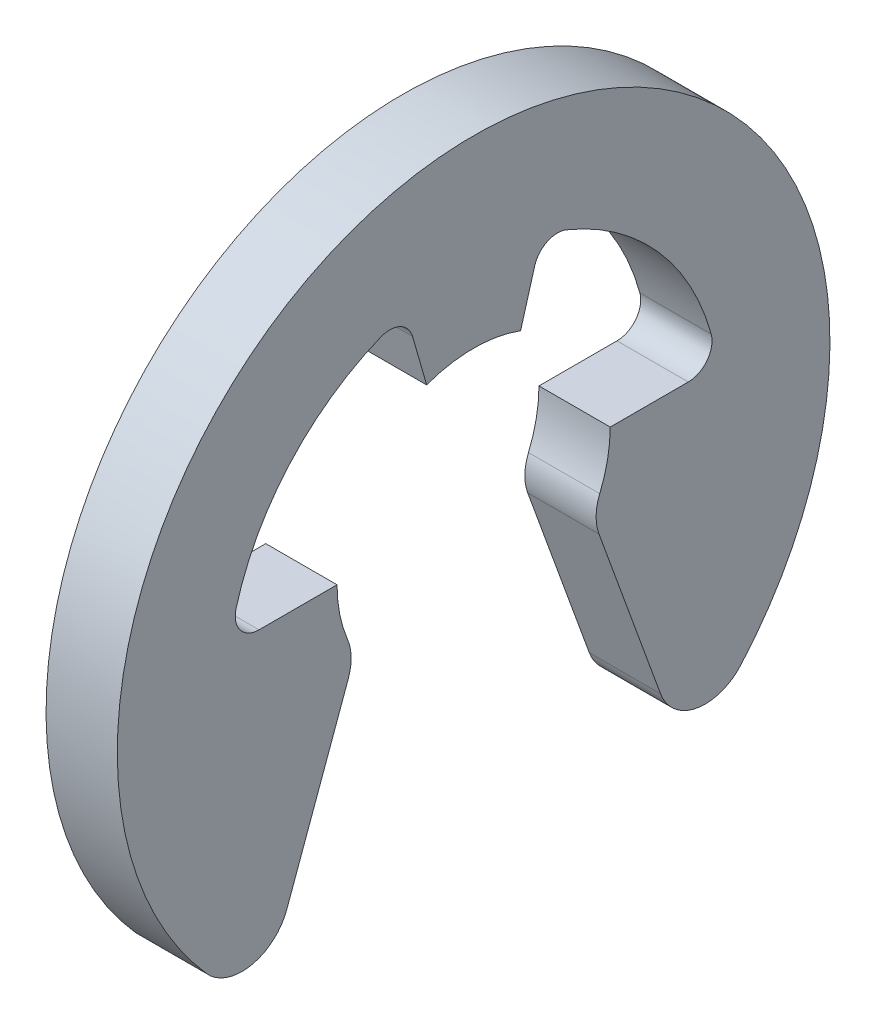
ISO-10303-21;
HEADER;
FILE_DESCRIPTION(('STEP AP214'),'2;1');
FILE_NAME('part.step','',(''),(''),'','','');
FILE_SCHEMA(('AUTOMOTIVE_DESIGN { 1 0 10303 214 1 1 1 1 }'));
ENDSEC;
DATA;
#1=APPLICATION_CONTEXT('core data for automotive mechanical design processes');
#2=APPLICATION_PROTOCOL_DEFINITION('international standard','automotive_design',2000,#1);
#3=PRODUCT_CONTEXT('',#1,'mechanical');
#4=PRODUCT('Part','Part','',(#3));
#5=PRODUCT_RELATED_PRODUCT_CATEGORY('part','',(#4));
#6=PRODUCT_DEFINITION_FORMATION('','',#4);
#7=PRODUCT_DEFINITION_CONTEXT('part definition',#1,'design');
#8=PRODUCT_DEFINITION('design','',#6,#7);
#9=PRODUCT_DEFINITION_SHAPE('','',#8);
#10=(LENGTH_UNIT() NAMED_UNIT(*) SI_UNIT(.MILLI.,.METRE.));
#11=(NAMED_UNIT(*) PLANE_ANGLE_UNIT() SI_UNIT($,.RADIAN.));
#12=(NAMED_UNIT(*) SI_UNIT($,.STERADIAN.) SOLID_ANGLE_UNIT());
#13=UNCERTAINTY_MEASURE_WITH_UNIT(LENGTH_MEASURE(1.E-05),#10,'distance_accuracy_value','');
#14=(GEOMETRIC_REPRESENTATION_CONTEXT(3) GLOBAL_UNCERTAINTY_ASSIGNED_CONTEXT((#13)) GLOBAL_UNIT_ASSIGNED_CONTEXT((#10,
#11,#12)) REPRESENTATION_CONTEXT('',''));
#15=CARTESIAN_POINT('',(0.,0.,0.));
#16=DIRECTION('',(0.,0.,1.));
#17=DIRECTION('',(1.,0.,0.));
#18=AXIS2_PLACEMENT_3D('',#15,#16,#17);
#19=CARTESIAN_POINT('',(0.6,0.5,-1.80710403685012));
#20=DIRECTION('',(-1.,0.,0.));
#21=DIRECTION('',(0.,0.,1.));
#22=AXIS2_PLACEMENT_3D('',#19,#20,#21);
#23=CYLINDRICAL_SURFACE('',#22,0.2);
#24=CARTESIAN_POINT('',(0.,0.5,-1.80710403685012));
#25=DIRECTION('',(-1.,0.,0.));
#26=DIRECTION('',(0.,0.,1.));
#27=AXIS2_PLACEMENT_3D('',#24,#25,#26);
#28=CIRCLE('',#27,0.2);
#29=CARTESIAN_POINT('',(0.,0.553333333333334,-1.9998618007808));
#30=VERTEX_POINT('',#29);
#31=CARTESIAN_POINT('',(0.,0.3,-1.80710403685012));
#32=VERTEX_POINT('',#31);
#33=EDGE_CURVE('E201',#30,#32,#28,.T.);
#34=ORIENTED_EDGE('',*,*,#33,.T.);
#35=DIRECTION('',(-1.,0.,0.));
#36=VECTOR('',#35,1.);
#37=CARTESIAN_POINT('',(0.6,0.3,-1.80710403685012));
#38=LINE('',#37,#36);
#39=CARTESIAN_POINT('',(0.6,0.3,-1.80710403685012));
#40=VERTEX_POINT('',#39);
#41=EDGE_CURVE('E11',#40,#32,#38,.T.);
#42=ORIENTED_EDGE('',*,*,#41,.F.);
#43=CARTESIAN_POINT('',(0.6,0.5,-1.80710403685012));
#44=DIRECTION('',(-1.,0.,0.));
#45=DIRECTION('',(0.,0.,1.));
#46=AXIS2_PLACEMENT_3D('',#43,#44,#45);
#47=CIRCLE('',#46,0.2);
#48=CARTESIAN_POINT('',(0.6,0.553333333333334,-1.9998618007808));
#49=VERTEX_POINT('',#48);
#50=EDGE_CURVE('E123',#49,#40,#47,.T.);
#51=ORIENTED_EDGE('',*,*,#50,.F.);
#52=DIRECTION('',(-1.,0.,0.));
#53=VECTOR('',#52,1.);
#54=CARTESIAN_POINT('',(0.6,0.553333333333334,-1.9998618007808));
#55=LINE('',#54,#53);
#56=EDGE_CURVE('E50',#49,#30,#55,.T.);
#57=ORIENTED_EDGE('',*,*,#56,.T.);
#58=EDGE_LOOP('',(#34,#42,#51,#57));
#59=FACE_BOUND('',#58,.T.);
#60=ADVANCED_FACE('F34',(#59),#23,.F.);
#61=CARTESIAN_POINT('',(0.6,0.3,-1.15));
#62=DIRECTION('',(0.,1.,0.));
#63=DIRECTION('',(0.,0.,1.));
#64=AXIS2_PLACEMENT_3D('',#61,#62,#63);
#65=PLANE('',#64);
#66=DIRECTION('',(0.,0.,-1.));
#67=VECTOR('',#66,1.);
#68=CARTESIAN_POINT('',(0.,0.3,-1.15));
#69=LINE('',#68,#67);
#70=CARTESIAN_POINT('',(0.,0.3,-1.15));
#71=VERTEX_POINT('',#70);
#72=EDGE_CURVE('E203',#71,#32,#69,.T.);
#73=ORIENTED_EDGE('',*,*,#72,.F.);
#74=DIRECTION('',(-1.,0.,0.));
#75=VECTOR('',#74,1.);
#76=CARTESIAN_POINT('',(0.6,0.3,-1.15));
#77=LINE('',#76,#75);
#78=CARTESIAN_POINT('',(0.6,0.3,-1.15));
#79=VERTEX_POINT('',#78);
#80=EDGE_CURVE('E42',#79,#71,#77,.T.);
#81=ORIENTED_EDGE('',*,*,#80,.F.);
#82=DIRECTION('',(0.,0.,-1.));
#83=VECTOR('',#82,1.);
#84=CARTESIAN_POINT('',(0.6,0.3,-1.15));
#85=LINE('',#84,#83);
#86=EDGE_CURVE('E301',#79,#40,#85,.T.);
#87=ORIENTED_EDGE('',*,*,#86,.T.);
#88=ORIENTED_EDGE('',*,*,#41,.T.);
#89=EDGE_LOOP('',(#73,#81,#87,#88));
#90=FACE_BOUND('',#89,.T.);
#91=ADVANCED_FACE('F300',(#90),#65,.T.);
#92=CARTESIAN_POINT('',(0.6,0.3,0.));
#93=DIRECTION('',(-1.,0.,0.));
#94=DIRECTION('',(0.,0.,1.));
#95=AXIS2_PLACEMENT_3D('',#92,#93,#94);
#96=CYLINDRICAL_SURFACE('',#95,1.15);
#97=CARTESIAN_POINT('',(0.,0.3,0.));
#98=DIRECTION('',(-1.,0.,0.));
#99=DIRECTION('',(0.,0.,1.));
#100=AXIS2_PLACEMENT_3D('',#97,#98,#99);
#101=CIRCLE('',#100,1.15);
#102=CARTESIAN_POINT('',(0.,-0.141786382645896,-1.06175552370056));
#103=VERTEX_POINT('',#102);
#104=EDGE_CURVE('E206',#71,#103,#101,.T.);
#105=ORIENTED_EDGE('',*,*,#104,.T.);
#106=DIRECTION('',(-1.,0.,0.));
#107=VECTOR('',#106,1.);
#108=CARTESIAN_POINT('',(0.6,-0.141786382645896,-1.06175552370056));
#109=LINE('',#108,#107);
#110=CARTESIAN_POINT('',(0.6,-0.141786382645896,-1.06175552370056));
#111=VERTEX_POINT('',#110);
#112=EDGE_CURVE('E286',#111,#103,#109,.T.);
#113=ORIENTED_EDGE('',*,*,#112,.F.);
#114=CARTESIAN_POINT('',(0.6,0.3,0.));
#115=DIRECTION('',(-1.,0.,0.));
#116=DIRECTION('',(0.,0.,1.));
#117=AXIS2_PLACEMENT_3D('',#114,#115,#116);
#118=CIRCLE('',#117,1.15);
#119=EDGE_CURVE('E292',#79,#111,#118,.T.);
#120=ORIENTED_EDGE('',*,*,#119,.F.);
#121=ORIENTED_EDGE('',*,*,#80,.T.);
#122=EDGE_LOOP('',(#105,#113,#120,#121));
#123=FACE_BOUND('',#122,.T.);
#124=ADVANCED_FACE('F290',(#123),#96,.F.);
#125=CARTESIAN_POINT('',(0.6,-0.295451211392294,-1.4310617928138));
#126=DIRECTION('',(-1.,0.,0.));
#127=DIRECTION('',(0.,0.,1.));
#128=AXIS2_PLACEMENT_3D('',#125,#126,#127);
#129=CYLINDRICAL_SURFACE('',#128,0.400000000000001);
#130=CARTESIAN_POINT('',(0.,-0.295451211392294,-1.4310617928138));
#131=DIRECTION('',(-1.,0.,0.));
#132=DIRECTION('',(0.,0.,1.));
#133=AXIS2_PLACEMENT_3D('',#130,#131,#132);
#134=CIRCLE('',#133,0.400000000000001);
#135=CARTESIAN_POINT('',(0.,-0.432259268722562,-1.05518474449944));
#136=VERTEX_POINT('',#135);
#137=EDGE_CURVE('E209',#136,#103,#134,.T.);
#138=ORIENTED_EDGE('',*,*,#137,.F.);
#139=DIRECTION('',(-1.,0.,0.));
#140=VECTOR('',#139,1.);
#141=CARTESIAN_POINT('',(0.6,-0.432259268722562,-1.05518474449944));
#142=LINE('',#141,#140);
#143=CARTESIAN_POINT('',(0.6,-0.432259268722562,-1.05518474449944));
#144=VERTEX_POINT('',#143);
#145=EDGE_CURVE('E284',#144,#136,#142,.T.);
#146=ORIENTED_EDGE('',*,*,#145,.F.);
#147=CARTESIAN_POINT('',(0.6,-0.295451211392294,-1.4310617928138));
#148=DIRECTION('',(-1.,0.,0.));
#149=DIRECTION('',(0.,0.,1.));
#150=AXIS2_PLACEMENT_3D('',#147,#148,#149);
#151=CIRCLE('',#150,0.400000000000001);
#152=EDGE_CURVE('E549',#144,#111,#151,.T.);
#153=ORIENTED_EDGE('',*,*,#152,.T.);
#154=ORIENTED_EDGE('',*,*,#112,.T.);
#155=EDGE_LOOP('',(#138,#146,#153,#154));
#156=FACE_BOUND('',#155,.T.);
#157=ADVANCED_FACE('F319',(#156),#129,.T.);
#158=CARTESIAN_POINT('',(0.6,-0.432259268722562,-1.05518474449944));
#159=DIRECTION('',(0.,0.34202014332567,-0.939692620785908));
#160=DIRECTION('',(0.,0.939692620785908,0.34202014332567));
#161=AXIS2_PLACEMENT_3D('',#158,#159,#160);
#162=PLANE('',#161);
#163=DIRECTION('',(0.,-0.939692620785908,-0.34202014332567));
#164=VECTOR('',#163,1.);
#165=CARTESIAN_POINT('',(0.,-0.432259268722562,-1.05518474449944));
#166=LINE('',#165,#164);
#167=CARTESIAN_POINT('',(0.,-1.85697983333298,-1.57374062216457));
#168=VERTEX_POINT('',#167);
#169=EDGE_CURVE('E212',#136,#168,#166,.T.);
#170=ORIENTED_EDGE('',*,*,#169,.T.);
#171=DIRECTION('',(-1.,0.,0.));
#172=VECTOR('',#171,1.);
#173=CARTESIAN_POINT('',(0.6,-1.85697983333298,-1.57374062216457));
#174=LINE('',#173,#172);
#175=CARTESIAN_POINT('',(0.6,-1.85697983333298,-1.57374062216457));
#176=VERTEX_POINT('',#175);
#177=EDGE_CURVE('E282',#176,#168,#174,.T.);
#178=ORIENTED_EDGE('',*,*,#177,.F.);
#179=DIRECTION('',(0.,-0.939692620785908,-0.34202014332567));
#180=VECTOR('',#179,1.);
#181=CARTESIAN_POINT('',(0.6,-0.432259268722562,-1.05518474449944));
#182=LINE('',#181,#180);
#183=EDGE_CURVE('E550',#144,#176,#182,.T.);
#184=ORIENTED_EDGE('',*,*,#183,.F.);
#185=ORIENTED_EDGE('',*,*,#145,.T.);
#186=EDGE_LOOP('',(#170,#178,#184,#185));
#187=FACE_BOUND('',#186,.T.);
#188=ADVANCED_FACE('F324',(#187),#162,.F.);
#189=CARTESIAN_POINT('',(0.6,-1.72017177600271,-1.94961767047893));
#190=DIRECTION('',(-1.,0.,0.));
#191=DIRECTION('',(0.,0.,1.));
#192=AXIS2_PLACEMENT_3D('',#189,#190,#191);
#193=CYLINDRICAL_SURFACE('',#192,0.399999999999999);
#194=CARTESIAN_POINT('',(0.,-1.72017177600271,-1.94961767047893));
#195=DIRECTION('',(-1.,0.,0.));
#196=DIRECTION('',(0.,0.,1.));
#197=AXIS2_PLACEMENT_3D('',#194,#195,#196);
#198=CIRCLE('',#197,0.399999999999999);
#199=CARTESIAN_POINT('',(0.,-1.98481358769543,-2.24955885055261));
#200=VERTEX_POINT('',#199);
#201=EDGE_CURVE('E215',#200,#168,#198,.T.);
#202=ORIENTED_EDGE('',*,*,#201,.F.);
#203=DIRECTION('',(-1.,0.,0.));
#204=VECTOR('',#203,1.);
#205=CARTESIAN_POINT('',(0.6,-1.98481358769543,-2.24955885055261));
#206=LINE('',#205,#204);
#207=CARTESIAN_POINT('',(0.6,-1.98481358769543,-2.24955885055261));
#208=VERTEX_POINT('',#207);
#209=EDGE_CURVE('E280',#208,#200,#206,.T.);
#210=ORIENTED_EDGE('',*,*,#209,.F.);
#211=CARTESIAN_POINT('',(0.6,-1.72017177600271,-1.94961767047893));
#212=DIRECTION('',(-1.,0.,0.));
#213=DIRECTION('',(0.,0.,1.));
#214=AXIS2_PLACEMENT_3D('',#211,#212,#213);
#215=CIRCLE('',#214,0.399999999999999);
#216=EDGE_CURVE('E545',#208,#176,#215,.T.);
#217=ORIENTED_EDGE('',*,*,#216,.T.);
#218=ORIENTED_EDGE('',*,*,#177,.T.);
#219=EDGE_LOOP('',(#202,#210,#217,#218));
#220=FACE_BOUND('',#219,.T.);
#221=ADVANCED_FACE('F328',(#220),#193,.T.);
#222=CARTESIAN_POINT('',(0.6,0.,0.));
#223=DIRECTION('',(-1.,0.,0.));
#224=DIRECTION('',(0.,0.,1.));
#225=AXIS2_PLACEMENT_3D('',#222,#223,#224);
#226=CYLINDRICAL_SURFACE('',#225,3.);
#227=CARTESIAN_POINT('',(0.,0.,0.));
#228=DIRECTION('',(1.,0.,0.));
#229=DIRECTION('',(0.,0.,-1.));
#230=AXIS2_PLACEMENT_3D('',#227,#228,#229);
#231=CIRCLE('',#230,3.);
#232=CARTESIAN_POINT('',(0.,-1.98481358769543,2.24955885055261));
#233=VERTEX_POINT('',#232);
#234=EDGE_CURVE('E218',#200,#233,#231,.T.);
#235=ORIENTED_EDGE('',*,*,#234,.T.);
#236=DIRECTION('',(-1.,0.,0.));
#237=VECTOR('',#236,1.);
#238=CARTESIAN_POINT('',(0.6,-1.98481358769543,2.24955885055261));
#239=LINE('',#238,#237);
#240=CARTESIAN_POINT('',(0.6,-1.98481358769543,2.24955885055261));
#241=VERTEX_POINT('',#240);
#242=EDGE_CURVE('E277',#241,#233,#239,.T.);
#243=ORIENTED_EDGE('',*,*,#242,.F.);
#244=CARTESIAN_POINT('',(0.6,0.,0.));
#245=DIRECTION('',(1.,0.,0.));
#246=DIRECTION('',(0.,0.,-1.));
#247=AXIS2_PLACEMENT_3D('',#244,#245,#246);
#248=CIRCLE('',#247,3.);
#249=EDGE_CURVE('E557',#208,#241,#248,.T.);
#250=ORIENTED_EDGE('',*,*,#249,.F.);
#251=ORIENTED_EDGE('',*,*,#209,.T.);
#252=EDGE_LOOP('',(#235,#243,#250,#251));
#253=FACE_BOUND('',#252,.T.);
#254=ADVANCED_FACE('F332',(#253),#226,.T.);
#255=CARTESIAN_POINT('',(0.6,-1.72017177600271,1.94961767047893));
#256=DIRECTION('',(-1.,0.,0.));
#257=DIRECTION('',(0.,0.,1.));
#258=AXIS2_PLACEMENT_3D('',#255,#256,#257);
#259=CYLINDRICAL_SURFACE('',#258,0.399999999999999);
#260=CARTESIAN_POINT('',(0.,-1.72017177600271,1.94961767047893));
#261=DIRECTION('',(1.,0.,0.));
#262=DIRECTION('',(0.,0.,-1.));
#263=AXIS2_PLACEMENT_3D('',#260,#261,#262);
#264=CIRCLE('',#263,0.399999999999999);
#265=CARTESIAN_POINT('',(0.,-1.85697983333298,1.57374062216457));
#266=VERTEX_POINT('',#265);
#267=EDGE_CURVE('E220',#233,#266,#264,.T.);
#268=ORIENTED_EDGE('',*,*,#267,.T.);
#269=DIRECTION('',(-1.,0.,0.));
#270=VECTOR('',#269,1.);
#271=CARTESIAN_POINT('',(0.6,-1.85697983333298,1.57374062216457));
#272=LINE('',#271,#270);
#273=CARTESIAN_POINT('',(0.6,-1.85697983333298,1.57374062216457));
#274=VERTEX_POINT('',#273);
#275=EDGE_CURVE('E275',#274,#266,#272,.T.);
#276=ORIENTED_EDGE('',*,*,#275,.F.);
#277=CARTESIAN_POINT('',(0.6,-1.72017177600271,1.94961767047893));
#278=DIRECTION('',(1.,0.,0.));
#279=DIRECTION('',(0.,0.,-1.));
#280=AXIS2_PLACEMENT_3D('',#277,#278,#279);
#281=CIRCLE('',#280,0.399999999999999);
#282=EDGE_CURVE('E559',#241,#274,#281,.T.);
#283=ORIENTED_EDGE('',*,*,#282,.F.);
#284=ORIENTED_EDGE('',*,*,#242,.T.);
#285=EDGE_LOOP('',(#268,#276,#283,#284));
#286=FACE_BOUND('',#285,.T.);
#287=ADVANCED_FACE('F336',(#286),#259,.T.);
#288=CARTESIAN_POINT('',(0.6,-0.432259268722562,1.05518474449944));
#289=DIRECTION('',(0.,-0.34202014332567,-0.939692620785908));
#290=DIRECTION('',(0.,0.939692620785908,-0.34202014332567));
#291=AXIS2_PLACEMENT_3D('',#288,#289,#290);
#292=PLANE('',#291);
#293=DIRECTION('',(0.,-0.939692620785908,0.34202014332567));
#294=VECTOR('',#293,1.);
#295=CARTESIAN_POINT('',(0.,-0.432259268722562,1.05518474449944));
#296=LINE('',#295,#294);
#297=CARTESIAN_POINT('',(0.,-0.432259268722562,1.05518474449944));
#298=VERTEX_POINT('',#297);
#299=EDGE_CURVE('E223',#298,#266,#296,.T.);
#300=ORIENTED_EDGE('',*,*,#299,.F.);
#301=DIRECTION('',(-1.,0.,0.));
#302=VECTOR('',#301,1.);
#303=CARTESIAN_POINT('',(0.6,-0.432259268722562,1.05518474449944));
#304=LINE('',#303,#302);
#305=CARTESIAN_POINT('',(0.6,-0.432259268722562,1.05518474449944));
#306=VERTEX_POINT('',#305);
#307=EDGE_CURVE('E273',#306,#298,#304,.T.);
#308=ORIENTED_EDGE('',*,*,#307,.F.);
#309=DIRECTION('',(0.,-0.939692620785908,0.34202014332567));
#310=VECTOR('',#309,1.);
#311=CARTESIAN_POINT('',(0.6,-0.432259268722562,1.05518474449944));
#312=LINE('',#311,#310);
#313=EDGE_CURVE('E536',#306,#274,#312,.T.);
#314=ORIENTED_EDGE('',*,*,#313,.T.);
#315=ORIENTED_EDGE('',*,*,#275,.T.);
#316=EDGE_LOOP('',(#300,#308,#314,#315));
#317=FACE_BOUND('',#316,.T.);
#318=ADVANCED_FACE('F340',(#317),#292,.T.);
#319=CARTESIAN_POINT('',(0.6,-0.295451211392294,1.4310617928138));
#320=DIRECTION('',(-1.,0.,0.));
#321=DIRECTION('',(0.,0.,1.));
#322=AXIS2_PLACEMENT_3D('',#319,#320,#321);
#323=CYLINDRICAL_SURFACE('',#322,0.400000000000001);
#324=CARTESIAN_POINT('',(0.,-0.295451211392294,1.4310617928138));
#325=DIRECTION('',(1.,0.,0.));
#326=DIRECTION('',(0.,0.,-1.));
#327=AXIS2_PLACEMENT_3D('',#324,#325,#326);
#328=CIRCLE('',#327,0.400000000000001);
#329=CARTESIAN_POINT('',(0.,-0.141786382645896,1.06175552370056));
#330=VERTEX_POINT('',#329);
#331=EDGE_CURVE('E226',#298,#330,#328,.T.);
#332=ORIENTED_EDGE('',*,*,#331,.T.);
#333=DIRECTION('',(-1.,0.,0.));
#334=VECTOR('',#333,1.);
#335=CARTESIAN_POINT('',(0.6,-0.141786382645896,1.06175552370056));
#336=LINE('',#335,#334);
#337=CARTESIAN_POINT('',(0.6,-0.141786382645896,1.06175552370056));
#338=VERTEX_POINT('',#337);
#339=EDGE_CURVE('E271',#338,#330,#336,.T.);
#340=ORIENTED_EDGE('',*,*,#339,.F.);
#341=CARTESIAN_POINT('',(0.6,-0.295451211392294,1.4310617928138));
#342=DIRECTION('',(1.,0.,0.));
#343=DIRECTION('',(0.,0.,-1.));
#344=AXIS2_PLACEMENT_3D('',#341,#342,#343);
#345=CIRCLE('',#344,0.400000000000001);
#346=EDGE_CURVE('E562',#306,#338,#345,.T.);
#347=ORIENTED_EDGE('',*,*,#346,.F.);
#348=ORIENTED_EDGE('',*,*,#307,.T.);
#349=EDGE_LOOP('',(#332,#340,#347,#348));
#350=FACE_BOUND('',#349,.T.);
#351=ADVANCED_FACE('F344',(#350),#323,.T.);
#352=CARTESIAN_POINT('',(0.6,0.3,0.));
#353=DIRECTION('',(-1.,0.,0.));
#354=DIRECTION('',(0.,0.,1.));
#355=AXIS2_PLACEMENT_3D('',#352,#353,#354);
#356=CYLINDRICAL_SURFACE('',#355,1.15);
#357=CARTESIAN_POINT('',(0.,0.3,0.));
#358=DIRECTION('',(1.,0.,0.));
#359=DIRECTION('',(0.,0.,-1.));
#360=AXIS2_PLACEMENT_3D('',#357,#358,#359);
#361=CIRCLE('',#360,1.15);
#362=CARTESIAN_POINT('',(0.,0.3,1.15));
#363=VERTEX_POINT('',#362);
#364=EDGE_CURVE('E229',#363,#330,#361,.T.);
#365=ORIENTED_EDGE('',*,*,#364,.F.);
#366=DIRECTION('',(-1.,0.,0.));
#367=VECTOR('',#366,1.);
#368=CARTESIAN_POINT('',(0.6,0.3,1.15));
#369=LINE('',#368,#367);
#370=CARTESIAN_POINT('',(0.6,0.3,1.15));
#371=VERTEX_POINT('',#370);
#372=EDGE_CURVE('E269',#371,#363,#369,.T.);
#373=ORIENTED_EDGE('',*,*,#372,.F.);
#374=CARTESIAN_POINT('',(0.6,0.3,0.));
#375=DIRECTION('',(1.,0.,0.));
#376=DIRECTION('',(0.,0.,-1.));
#377=AXIS2_PLACEMENT_3D('',#374,#375,#376);
#378=CIRCLE('',#377,1.15);
#379=EDGE_CURVE('E529',#371,#338,#378,.T.);
#380=ORIENTED_EDGE('',*,*,#379,.T.);
#381=ORIENTED_EDGE('',*,*,#339,.T.);
#382=EDGE_LOOP('',(#365,#373,#380,#381));
#383=FACE_BOUND('',#382,.T.);
#384=ADVANCED_FACE('F348',(#383),#356,.F.);
#385=CARTESIAN_POINT('',(0.6,0.3,1.15));
#386=DIRECTION('',(0.,-1.,0.));
#387=DIRECTION('',(0.,0.,-1.));
#388=AXIS2_PLACEMENT_3D('',#385,#386,#387);
#389=PLANE('',#388);
#390=DIRECTION('',(0.,0.,1.));
#391=VECTOR('',#390,1.);
#392=CARTESIAN_POINT('',(0.,0.3,1.15));
#393=LINE('',#392,#391);
#394=CARTESIAN_POINT('',(0.,0.3,1.80710403685012));
#395=VERTEX_POINT('',#394);
#396=EDGE_CURVE('E232',#363,#395,#393,.T.);
#397=ORIENTED_EDGE('',*,*,#396,.T.);
#398=DIRECTION('',(-1.,0.,0.));
#399=VECTOR('',#398,1.);
#400=CARTESIAN_POINT('',(0.6,0.3,1.80710403685012));
#401=LINE('',#400,#399);
#402=CARTESIAN_POINT('',(0.6,0.3,1.80710403685012));
#403=VERTEX_POINT('',#402);
#404=EDGE_CURVE('E267',#403,#395,#401,.T.);
#405=ORIENTED_EDGE('',*,*,#404,.F.);
#406=DIRECTION('',(0.,0.,1.));
#407=VECTOR('',#406,1.);
#408=CARTESIAN_POINT('',(0.6,0.3,1.15));
#409=LINE('',#408,#407);
#410=EDGE_CURVE('E565',#371,#403,#409,.T.);
#411=ORIENTED_EDGE('',*,*,#410,.F.);
#412=ORIENTED_EDGE('',*,*,#372,.T.);
#413=EDGE_LOOP('',(#397,#405,#411,#412));
#414=FACE_BOUND('',#413,.T.);
#415=ADVANCED_FACE('F352',(#414),#389,.F.);
#416=CARTESIAN_POINT('',(0.6,0.5,1.80710403685012));
#417=DIRECTION('',(-1.,0.,0.));
#418=DIRECTION('',(0.,0.,1.));
#419=AXIS2_PLACEMENT_3D('',#416,#417,#418);
#420=CYLINDRICAL_SURFACE('',#419,0.2);
#421=CARTESIAN_POINT('',(0.,0.5,1.80710403685012));
#422=DIRECTION('',(1.,0.,0.));
#423=DIRECTION('',(0.,0.,-1.));
#424=AXIS2_PLACEMENT_3D('',#421,#422,#423);
#425=CIRCLE('',#424,0.2);
#426=CARTESIAN_POINT('',(0.,0.553333333333333,1.9998618007808));
#427=VERTEX_POINT('',#426);
#428=EDGE_CURVE('E235',#427,#395,#425,.T.);
#429=ORIENTED_EDGE('',*,*,#428,.F.);
#430=DIRECTION('',(-1.,0.,0.));
#431=VECTOR('',#430,1.);
#432=CARTESIAN_POINT('',(0.6,0.553333333333333,1.9998618007808));
#433=LINE('',#432,#431);
#434=CARTESIAN_POINT('',(0.6,0.553333333333333,1.9998618007808));
#435=VERTEX_POINT('',#434);
#436=EDGE_CURVE('E265',#435,#427,#433,.T.);
#437=ORIENTED_EDGE('',*,*,#436,.F.);
#438=CARTESIAN_POINT('',(0.6,0.5,1.80710403685012));
#439=DIRECTION('',(1.,0.,0.));
#440=DIRECTION('',(0.,0.,-1.));
#441=AXIS2_PLACEMENT_3D('',#438,#439,#440);
#442=CIRCLE('',#441,0.2);
#443=EDGE_CURVE('E522',#435,#403,#442,.T.);
#444=ORIENTED_EDGE('',*,*,#443,.T.);
#445=ORIENTED_EDGE('',*,*,#404,.T.);
#446=EDGE_LOOP('',(#429,#437,#444,#445));
#447=FACE_BOUND('',#446,.T.);
#448=ADVANCED_FACE('F356',(#447),#420,.F.);
#449=CARTESIAN_POINT('',(0.6,0.,0.));
#450=DIRECTION('',(-1.,0.,0.));
#451=DIRECTION('',(0.,0.,1.));
#452=AXIS2_PLACEMENT_3D('',#449,#450,#451);
#453=CYLINDRICAL_SURFACE('',#452,2.075);
#454=CARTESIAN_POINT('',(0.,0.,0.));
#455=DIRECTION('',(-1.,0.,0.));
#456=DIRECTION('',(0.,0.,1.));
#457=AXIS2_PLACEMENT_3D('',#454,#455,#456);
#458=CIRCLE('',#457,2.075);
#459=CARTESIAN_POINT('',(0.,1.92223066273167,0.781443714706423));
#460=VERTEX_POINT('',#459);
#461=EDGE_CURVE('E238',#427,#460,#458,.T.);
#462=ORIENTED_EDGE('',*,*,#461,.T.);
#463=DIRECTION('',(-1.,0.,0.));
#464=VECTOR('',#463,1.);
#465=CARTESIAN_POINT('',(0.6,1.92223066273167,0.781443714706423));
#466=LINE('',#465,#464);
#467=CARTESIAN_POINT('',(0.6,1.92223066273167,0.781443714706423));
#468=VERTEX_POINT('',#467);
#469=EDGE_CURVE('E262',#468,#460,#466,.T.);
#470=ORIENTED_EDGE('',*,*,#469,.F.);
#471=CARTESIAN_POINT('',(0.6,0.,0.));
#472=DIRECTION('',(-1.,0.,0.));
#473=DIRECTION('',(0.,0.,1.));
#474=AXIS2_PLACEMENT_3D('',#471,#472,#473);
#475=CIRCLE('',#474,2.075);
#476=EDGE_CURVE('E516',#435,#468,#475,.T.);
#477=ORIENTED_EDGE('',*,*,#476,.F.);
#478=ORIENTED_EDGE('',*,*,#436,.T.);
#479=EDGE_LOOP('',(#462,#470,#477,#478));
#480=FACE_BOUND('',#479,.T.);
#481=ADVANCED_FACE('F360',(#480),#453,.F.);
#482=CARTESIAN_POINT('',(0.6,1.73695541813103,0.706123838590141));
#483=DIRECTION('',(-1.,0.,0.));
#484=DIRECTION('',(0.,0.,1.));
#485=AXIS2_PLACEMENT_3D('',#482,#483,#484);
#486=CYLINDRICAL_SURFACE('',#485,0.2);
#487=CARTESIAN_POINT('',(0.,1.73695541813103,0.706123838590141));
#488=DIRECTION('',(-1.,0.,0.));
#489=DIRECTION('',(0.,0.,1.));
#490=AXIS2_PLACEMENT_3D('',#487,#488,#489);
#491=CIRCLE('',#490,0.2);
#492=CARTESIAN_POINT('',(0.,1.79208288929442,0.513871499402476));
#493=VERTEX_POINT('',#492);
#494=EDGE_CURVE('E240',#460,#493,#491,.T.);
#495=ORIENTED_EDGE('',*,*,#494,.T.);
#496=DIRECTION('',(-1.,0.,0.));
#497=VECTOR('',#496,1.);
#498=CARTESIAN_POINT('',(0.6,1.79208288929442,0.513871499402476));
#499=LINE('',#498,#497);
#500=CARTESIAN_POINT('',(0.6,1.79208288929442,0.513871499402476));
#501=VERTEX_POINT('',#500);
#502=EDGE_CURVE('E260',#501,#493,#499,.T.);
#503=ORIENTED_EDGE('',*,*,#502,.F.);
#504=CARTESIAN_POINT('',(0.6,1.73695541813103,0.706123838590141));
#505=DIRECTION('',(-1.,0.,0.));
#506=DIRECTION('',(0.,0.,1.));
#507=AXIS2_PLACEMENT_3D('',#504,#505,#506);
#508=CIRCLE('',#507,0.2);
#509=EDGE_CURVE('E514',#468,#501,#508,.T.);
#510=ORIENTED_EDGE('',*,*,#509,.F.);
#511=ORIENTED_EDGE('',*,*,#469,.T.);
#512=EDGE_LOOP('',(#495,#503,#510,#511));
#513=FACE_BOUND('',#512,.T.);
#514=ADVANCED_FACE('F364',(#513),#486,.F.);
#515=CARTESIAN_POINT('',(0.6,1.37979665704697,0.395650324693638));
#516=DIRECTION('',(0.,-0.275637355816994,0.96126169593832));
#517=DIRECTION('',(0.,-0.961261695938321,-0.275637355816994));
#518=AXIS2_PLACEMENT_3D('',#515,#516,#517);
#519=PLANE('',#518);
#520=DIRECTION('',(0.,0.96126169593832,0.275637355816994));
#521=VECTOR('',#520,1.);
#522=CARTESIAN_POINT('',(0.,1.37979665704697,0.395650324693638));
#523=LINE('',#522,#521);
#524=CARTESIAN_POINT('',(0.,1.37979665704697,0.395650324693638));
#525=VERTEX_POINT('',#524);
#526=EDGE_CURVE('E243',#525,#493,#523,.T.);
#527=ORIENTED_EDGE('',*,*,#526,.F.);
#528=DIRECTION('',(-1.,0.,0.));
#529=VECTOR('',#528,1.);
#530=CARTESIAN_POINT('',(0.6,1.37979665704697,0.395650324693638));
#531=LINE('',#530,#529);
#532=CARTESIAN_POINT('',(0.6,1.37979665704697,0.395650324693638));
#533=VERTEX_POINT('',#532);
#534=EDGE_CURVE('E258',#533,#525,#531,.T.);
#535=ORIENTED_EDGE('',*,*,#534,.F.);
#536=DIRECTION('',(0.,0.96126169593832,0.275637355816994));
#537=VECTOR('',#536,1.);
#538=CARTESIAN_POINT('',(0.6,1.37979665704697,0.395650324693638));
#539=LINE('',#538,#537);
#540=EDGE_CURVE('E511',#533,#501,#539,.T.);
#541=ORIENTED_EDGE('',*,*,#540,.T.);
#542=ORIENTED_EDGE('',*,*,#502,.T.);
#543=EDGE_LOOP('',(#527,#535,#541,#542));
#544=FACE_BOUND('',#543,.T.);
#545=ADVANCED_FACE('F368',(#544),#519,.T.);
#546=CARTESIAN_POINT('',(0.6,0.3,0.));
#547=DIRECTION('',(-1.,0.,0.));
#548=DIRECTION('',(0.,0.,1.));
#549=AXIS2_PLACEMENT_3D('',#546,#547,#548);
#550=CYLINDRICAL_SURFACE('',#549,1.15);
#551=CARTESIAN_POINT('',(0.,0.3,0.));
#552=DIRECTION('',(1.,0.,0.));
#553=DIRECTION('',(0.,0.,-1.));
#554=AXIS2_PLACEMENT_3D('',#551,#552,#553);
#555=CIRCLE('',#554,1.15);
#556=CARTESIAN_POINT('',(0.,1.37979665704697,-0.395650324693637));
#557=VERTEX_POINT('',#556);
#558=EDGE_CURVE('E246',#557,#525,#555,.T.);
#559=ORIENTED_EDGE('',*,*,#558,.F.);
#560=DIRECTION('',(-1.,0.,0.));
#561=VECTOR('',#560,1.);
#562=CARTESIAN_POINT('',(0.6,1.37979665704697,-0.395650324693637));
#563=LINE('',#562,#561);
#564=CARTESIAN_POINT('',(0.6,1.37979665704697,-0.395650324693637));
#565=VERTEX_POINT('',#564);
#566=EDGE_CURVE('E193',#565,#557,#563,.T.);
#567=ORIENTED_EDGE('',*,*,#566,.F.);
#568=CARTESIAN_POINT('',(0.6,0.3,0.));
#569=DIRECTION('',(1.,0.,0.));
#570=DIRECTION('',(0.,0.,-1.));
#571=AXIS2_PLACEMENT_3D('',#568,#569,#570);
#572=CIRCLE('',#571,1.15);
#573=EDGE_CURVE('E183',#565,#533,#572,.T.);
#574=ORIENTED_EDGE('',*,*,#573,.T.);
#575=ORIENTED_EDGE('',*,*,#534,.T.);
#576=EDGE_LOOP('',(#559,#567,#574,#575));
#577=FACE_BOUND('',#576,.T.);
#578=ADVANCED_FACE('F372',(#577),#550,.F.);
#579=CARTESIAN_POINT('',(0.6,1.37979665704697,-0.395650324693637));
#580=DIRECTION('',(0.,0.275637355816994,0.96126169593832));
#581=DIRECTION('',(0.,-0.961261695938321,0.275637355816994));
#582=AXIS2_PLACEMENT_3D('',#579,#580,#581);
#583=PLANE('',#582);
#584=DIRECTION('',(0.,0.96126169593832,-0.275637355816994));
#585=VECTOR('',#584,1.);
#586=CARTESIAN_POINT('',(0.,1.37979665704697,-0.395650324693637));
#587=LINE('',#586,#585);
#588=CARTESIAN_POINT('',(0.,1.79208288929442,-0.513871499402477));
#589=VERTEX_POINT('',#588);
#590=EDGE_CURVE('E190',#557,#589,#587,.T.);
#591=ORIENTED_EDGE('',*,*,#590,.T.);
#592=DIRECTION('',(-1.,0.,0.));
#593=VECTOR('',#592,1.);
#594=CARTESIAN_POINT('',(0.6,1.79208288929442,-0.513871499402477));
#595=LINE('',#594,#593);
#596=CARTESIAN_POINT('',(0.6,1.79208288929442,-0.513871499402477));
#597=VERTEX_POINT('',#596);
#598=EDGE_CURVE('E187',#597,#589,#595,.T.);
#599=ORIENTED_EDGE('',*,*,#598,.F.);
#600=DIRECTION('',(0.,0.96126169593832,-0.275637355816994));
#601=VECTOR('',#600,1.);
#602=CARTESIAN_POINT('',(0.6,1.37979665704697,-0.395650324693637));
#603=LINE('',#602,#601);
#604=EDGE_CURVE('E176',#565,#597,#603,.T.);
#605=ORIENTED_EDGE('',*,*,#604,.F.);
#606=ORIENTED_EDGE('',*,*,#566,.T.);
#607=EDGE_LOOP('',(#591,#599,#605,#606));
#608=FACE_BOUND('',#607,.T.);
#609=ADVANCED_FACE('F188',(#608),#583,.F.);
#610=CARTESIAN_POINT('',(0.6,1.73695541813103,-0.706123838590141));
#611=DIRECTION('',(-1.,0.,0.));
#612=DIRECTION('',(0.,0.,1.));
#613=AXIS2_PLACEMENT_3D('',#610,#611,#612);
#614=CYLINDRICAL_SURFACE('',#613,0.2);
#615=CARTESIAN_POINT('',(0.,1.73695541813103,-0.706123838590141));
#616=DIRECTION('',(1.,0.,0.));
#617=DIRECTION('',(0.,0.,-1.));
#618=AXIS2_PLACEMENT_3D('',#615,#616,#617);
#619=CIRCLE('',#618,0.2);
#620=CARTESIAN_POINT('',(0.,1.92223066273167,-0.781443714706422));
#621=VERTEX_POINT('',#620);
#622=EDGE_CURVE('E250',#621,#589,#619,.T.);
#623=ORIENTED_EDGE('',*,*,#622,.F.);
#624=DIRECTION('',(-1.,0.,0.));
#625=VECTOR('',#624,1.);
#626=CARTESIAN_POINT('',(0.6,1.92223066273167,-0.781443714706422));
#627=LINE('',#626,#625);
#628=CARTESIAN_POINT('',(0.6,1.92223066273167,-0.781443714706422));
#629=VERTEX_POINT('',#628);
#630=EDGE_CURVE('E111',#629,#621,#627,.T.);
#631=ORIENTED_EDGE('',*,*,#630,.F.);
#632=CARTESIAN_POINT('',(0.6,1.73695541813103,-0.706123838590141));
#633=DIRECTION('',(1.,0.,0.));
#634=DIRECTION('',(0.,0.,-1.));
#635=AXIS2_PLACEMENT_3D('',#632,#633,#634);
#636=CIRCLE('',#635,0.2);
#637=EDGE_CURVE('E180',#629,#597,#636,.T.);
#638=ORIENTED_EDGE('',*,*,#637,.T.);
#639=ORIENTED_EDGE('',*,*,#598,.T.);
#640=EDGE_LOOP('',(#623,#631,#638,#639));
#641=FACE_BOUND('',#640,.T.);
#642=ADVANCED_FACE('F195',(#641),#614,.F.);
#643=CARTESIAN_POINT('',(0.6,0.,0.));
#644=DIRECTION('',(-1.,0.,0.));
#645=DIRECTION('',(0.,0.,1.));
#646=AXIS2_PLACEMENT_3D('',#643,#644,#645);
#647=CYLINDRICAL_SURFACE('',#646,2.075);
#648=CARTESIAN_POINT('',(0.,0.,0.));
#649=DIRECTION('',(1.,0.,0.));
#650=DIRECTION('',(0.,0.,-1.));
#651=AXIS2_PLACEMENT_3D('',#648,#649,#650);
#652=CIRCLE('',#651,2.075);
#653=EDGE_CURVE('E252',#30,#621,#652,.T.);
#654=ORIENTED_EDGE('',*,*,#653,.F.);
#655=ORIENTED_EDGE('',*,*,#56,.F.);
#656=CARTESIAN_POINT('',(0.6,0.,0.));
#657=DIRECTION('',(1.,0.,0.));
#658=DIRECTION('',(0.,0.,-1.));
#659=AXIS2_PLACEMENT_3D('',#656,#657,#658);
#660=CIRCLE('',#659,2.075);
#661=EDGE_CURVE('E196',#49,#629,#660,.T.);
#662=ORIENTED_EDGE('',*,*,#661,.T.);
#663=ORIENTED_EDGE('',*,*,#630,.T.);
#664=EDGE_LOOP('',(#654,#655,#662,#663));
#665=FACE_BOUND('',#664,.T.);
#666=ADVANCED_FACE('F302',(#665),#647,.F.);
#667=CARTESIAN_POINT('',(0.6,0.5,-1.80710403685012));
#668=DIRECTION('',(-1.,0.,0.));
#669=DIRECTION('',(0.,0.,1.));
#670=AXIS2_PLACEMENT_3D('',#667,#668,#669);
#671=PLANE('',#670);
#672=ORIENTED_EDGE('',*,*,#50,.T.);
#673=ORIENTED_EDGE('',*,*,#86,.F.);
#674=ORIENTED_EDGE('',*,*,#119,.T.);
#675=ORIENTED_EDGE('',*,*,#152,.F.);
#676=ORIENTED_EDGE('',*,*,#183,.T.);
#677=ORIENTED_EDGE('',*,*,#216,.F.);
#678=ORIENTED_EDGE('',*,*,#249,.T.);
#679=ORIENTED_EDGE('',*,*,#282,.T.);
#680=ORIENTED_EDGE('',*,*,#313,.F.);
#681=ORIENTED_EDGE('',*,*,#346,.T.);
#682=ORIENTED_EDGE('',*,*,#379,.F.);
#683=ORIENTED_EDGE('',*,*,#410,.T.);
#684=ORIENTED_EDGE('',*,*,#443,.F.);
#685=ORIENTED_EDGE('',*,*,#476,.T.);
#686=ORIENTED_EDGE('',*,*,#509,.T.);
#687=ORIENTED_EDGE('',*,*,#540,.F.);
#688=ORIENTED_EDGE('',*,*,#573,.F.);
#689=ORIENTED_EDGE('',*,*,#604,.T.);
#690=ORIENTED_EDGE('',*,*,#637,.F.);
#691=ORIENTED_EDGE('',*,*,#661,.F.);
#692=EDGE_LOOP('',(#672,#673,#674,#675,#676,#677,#678,#679,#680,#681,#682,#683,#684,#685,#686,
#687,#688,#689,#690,#691));
#693=FACE_BOUND('',#692,.T.);
#694=ADVANCED_FACE('F178',(#693),#671,.F.);
#695=CARTESIAN_POINT('',(0.,0.5,-1.80710403685012));
#696=DIRECTION('',(-1.,0.,0.));
#697=DIRECTION('',(0.,0.,1.));
#698=AXIS2_PLACEMENT_3D('',#695,#696,#697);
#699=PLANE('',#698);
#700=ORIENTED_EDGE('',*,*,#33,.F.);
#701=ORIENTED_EDGE('',*,*,#653,.T.);
#702=ORIENTED_EDGE('',*,*,#622,.T.);
#703=ORIENTED_EDGE('',*,*,#590,.F.);
#704=ORIENTED_EDGE('',*,*,#558,.T.);
#705=ORIENTED_EDGE('',*,*,#526,.T.);
#706=ORIENTED_EDGE('',*,*,#494,.F.);
#707=ORIENTED_EDGE('',*,*,#461,.F.);
#708=ORIENTED_EDGE('',*,*,#428,.T.);
#709=ORIENTED_EDGE('',*,*,#396,.F.);
#710=ORIENTED_EDGE('',*,*,#364,.T.);
#711=ORIENTED_EDGE('',*,*,#331,.F.);
#712=ORIENTED_EDGE('',*,*,#299,.T.);
#713=ORIENTED_EDGE('',*,*,#267,.F.);
#714=ORIENTED_EDGE('',*,*,#234,.F.);
#715=ORIENTED_EDGE('',*,*,#201,.T.);
#716=ORIENTED_EDGE('',*,*,#169,.F.);
#717=ORIENTED_EDGE('',*,*,#137,.T.);
#718=ORIENTED_EDGE('',*,*,#104,.F.);
#719=ORIENTED_EDGE('',*,*,#72,.T.);
#720=EDGE_LOOP('',(#700,#701,#702,#703,#704,#705,#706,#707,#708,#709,#710,#711,#712,#713,#714,
#715,#716,#717,#718,#719));
#721=FACE_BOUND('',#720,.T.);
#722=ADVANCED_FACE('F297',(#721),#699,.T.);
#723=CLOSED_SHELL('',(#60,#91,#124,#157,#188,#221,#254,#287,#318,#351,#384,#415,#448,#481,#514,
#545,#578,#609,#642,#666,#694,#722));
#724=MANIFOLD_SOLID_BREP('B2',#723);
#725=ADVANCED_BREP_SHAPE_REPRESENTATION('',(#18,#724),#14);
#726=SHAPE_DEFINITION_REPRESENTATION(#9,#725);
ENDSEC;
END-ISO-10303-21;
